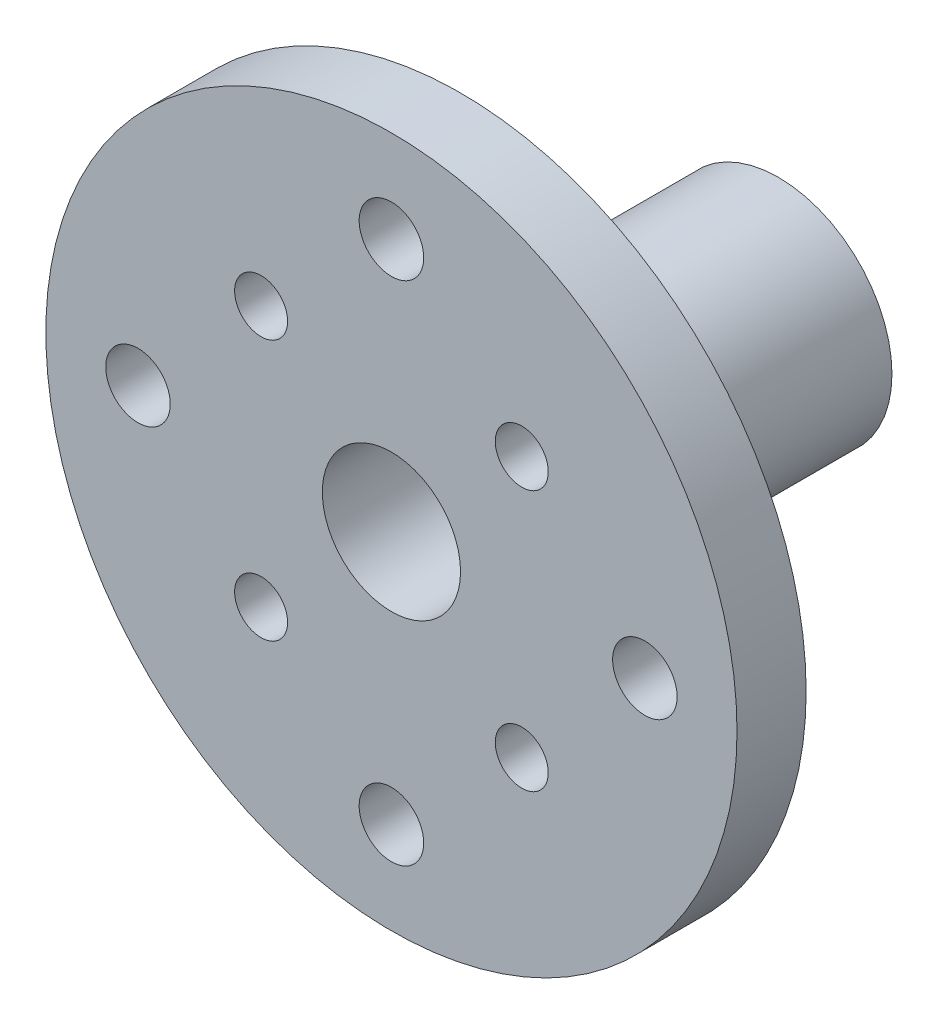
ISO-10303-21;
HEADER;
FILE_DESCRIPTION(('STEP AP214'),'2;1');
FILE_NAME('part.step','',(''),(''),'','','');
FILE_SCHEMA(('AUTOMOTIVE_DESIGN { 1 0 10303 214 1 1 1 1 }'));
ENDSEC;
DATA;
#1=APPLICATION_CONTEXT('core data for automotive mechanical design processes');
#2=APPLICATION_PROTOCOL_DEFINITION('international standard','automotive_design',2000,#1);
#3=PRODUCT_CONTEXT('',#1,'mechanical');
#4=PRODUCT('Part','Part','',(#3));
#5=PRODUCT_RELATED_PRODUCT_CATEGORY('part','',(#4));
#6=PRODUCT_DEFINITION_FORMATION('','',#4);
#7=PRODUCT_DEFINITION_CONTEXT('part definition',#1,'design');
#8=PRODUCT_DEFINITION('design','',#6,#7);
#9=PRODUCT_DEFINITION_SHAPE('','',#8);
#10=(LENGTH_UNIT() NAMED_UNIT(*) SI_UNIT(.MILLI.,.METRE.));
#11=(NAMED_UNIT(*) PLANE_ANGLE_UNIT() SI_UNIT($,.RADIAN.));
#12=(NAMED_UNIT(*) SI_UNIT($,.STERADIAN.) SOLID_ANGLE_UNIT());
#13=UNCERTAINTY_MEASURE_WITH_UNIT(LENGTH_MEASURE(1.E-05),#10,'distance_accuracy_value','');
#14=(GEOMETRIC_REPRESENTATION_CONTEXT(3) GLOBAL_UNCERTAINTY_ASSIGNED_CONTEXT((#13)) GLOBAL_UNIT_ASSIGNED_CONTEXT((#10,
#11,#12)) REPRESENTATION_CONTEXT('',''));
#15=CARTESIAN_POINT('',(0.,0.,0.));
#16=DIRECTION('',(0.,0.,1.));
#17=DIRECTION('',(1.,0.,0.));
#18=AXIS2_PLACEMENT_3D('',#15,#16,#17);
#19=CARTESIAN_POINT('',(0.,0.,13.8));
#20=DIRECTION('',(0.,0.,-1.));
#21=DIRECTION('',(-1.,0.,0.));
#22=AXIS2_PLACEMENT_3D('',#19,#20,#21);
#23=CYLINDRICAL_SURFACE('',#22,1.55);
#24=CARTESIAN_POINT('',(0.,0.,0.));
#25=DIRECTION('',(0.,0.,1.));
#26=DIRECTION('',(1.,0.,0.));
#27=AXIS2_PLACEMENT_3D('',#24,#25,#26);
#28=CIRCLE('',#27,1.55);
#29=CARTESIAN_POINT('',(-1.55,0.,0.));
#30=VERTEX_POINT('',#29);
#31=EDGE_CURVE('E52',#30,#30,#28,.T.);
#32=CARTESIAN_POINT('',(0.,0.,6.8));
#33=DIRECTION('',(0.,0.,1.));
#34=DIRECTION('',(1.,0.,0.));
#35=AXIS2_PLACEMENT_3D('',#32,#33,#34);
#36=CIRCLE('',#35,1.55);
#37=CARTESIAN_POINT('',(-1.55,0.,6.8));
#38=VERTEX_POINT('',#37);
#39=EDGE_CURVE('E41',#38,#38,#36,.T.);
#40=CARTESIAN_POINT('',(-1.55,0.,0.));
#41=CARTESIAN_POINT('',(-1.55,0.,0.0708333333333337));
#42=CARTESIAN_POINT('',(-1.55,0.,0.141666666666667));
#43=CARTESIAN_POINT('',(-1.55,0.,0.283333333333334));
#44=CARTESIAN_POINT('',(-1.55,0.,0.354166666666667));
#45=CARTESIAN_POINT('',(-1.55,0.,0.495833333333334));
#46=CARTESIAN_POINT('',(-1.55,0.,0.566666666666667));
#47=CARTESIAN_POINT('',(-1.55,0.,0.708333333333334));
#48=CARTESIAN_POINT('',(-1.55,0.,0.779166666666667));
#49=CARTESIAN_POINT('',(-1.55,0.,0.920833333333334));
#50=CARTESIAN_POINT('',(-1.55,0.,0.991666666666667));
#51=CARTESIAN_POINT('',(-1.55,0.,1.13333333333333));
#52=CARTESIAN_POINT('',(-1.55,0.,1.20416666666667));
#53=CARTESIAN_POINT('',(-1.55,0.,1.34583333333333));
#54=CARTESIAN_POINT('',(-1.55,0.,1.41666666666667));
#55=CARTESIAN_POINT('',(-1.55,0.,1.55833333333333));
#56=CARTESIAN_POINT('',(-1.55,0.,1.62916666666667));
#57=CARTESIAN_POINT('',(-1.55,0.,1.77083333333333));
#58=CARTESIAN_POINT('',(-1.55,0.,1.84166666666667));
#59=CARTESIAN_POINT('',(-1.55,0.,1.98333333333333));
#60=CARTESIAN_POINT('',(-1.55,0.,2.05416666666667));
#61=CARTESIAN_POINT('',(-1.55,0.,2.19583333333333));
#62=CARTESIAN_POINT('',(-1.55,0.,2.26666666666667));
#63=CARTESIAN_POINT('',(-1.55,0.,2.40833333333333));
#64=CARTESIAN_POINT('',(-1.55,0.,2.47916666666667));
#65=CARTESIAN_POINT('',(-1.55,0.,2.62083333333333));
#66=CARTESIAN_POINT('',(-1.55,0.,2.69166666666667));
#67=CARTESIAN_POINT('',(-1.55,0.,2.83333333333333));
#68=CARTESIAN_POINT('',(-1.55,0.,2.90416666666667));
#69=CARTESIAN_POINT('',(-1.55,0.,3.04583333333333));
#70=CARTESIAN_POINT('',(-1.55,0.,3.11666666666667));
#71=CARTESIAN_POINT('',(-1.55,0.,3.25833333333333));
#72=CARTESIAN_POINT('',(-1.55,0.,3.32916666666667));
#73=CARTESIAN_POINT('',(-1.55,0.,3.47083333333333));
#74=CARTESIAN_POINT('',(-1.55,0.,3.54166666666667));
#75=CARTESIAN_POINT('',(-1.55,0.,3.68333333333333));
#76=CARTESIAN_POINT('',(-1.55,0.,3.75416666666667));
#77=CARTESIAN_POINT('',(-1.55,0.,3.89583333333333));
#78=CARTESIAN_POINT('',(-1.55,0.,3.96666666666667));
#79=CARTESIAN_POINT('',(-1.55,0.,4.10833333333333));
#80=CARTESIAN_POINT('',(-1.55,0.,4.17916666666667));
#81=CARTESIAN_POINT('',(-1.55,0.,4.32083333333333));
#82=CARTESIAN_POINT('',(-1.55,0.,4.39166666666667));
#83=CARTESIAN_POINT('',(-1.55,0.,4.53333333333333));
#84=CARTESIAN_POINT('',(-1.55,0.,4.60416666666667));
#85=CARTESIAN_POINT('',(-1.55,0.,4.74583333333334));
#86=CARTESIAN_POINT('',(-1.55,0.,4.81666666666667));
#87=CARTESIAN_POINT('',(-1.55,0.,4.95833333333333));
#88=CARTESIAN_POINT('',(-1.55,0.,5.02916666666667));
#89=CARTESIAN_POINT('',(-1.55,0.,5.17083333333334));
#90=CARTESIAN_POINT('',(-1.55,0.,5.24166666666667));
#91=CARTESIAN_POINT('',(-1.55,0.,5.38333333333333));
#92=CARTESIAN_POINT('',(-1.55,0.,5.45416666666667));
#93=CARTESIAN_POINT('',(-1.55,0.,5.59583333333334));
#94=CARTESIAN_POINT('',(-1.55,0.,5.66666666666667));
#95=CARTESIAN_POINT('',(-1.55,0.,5.80833333333334));
#96=CARTESIAN_POINT('',(-1.55,0.,5.87916666666667));
#97=CARTESIAN_POINT('',(-1.55,0.,6.02083333333334));
#98=CARTESIAN_POINT('',(-1.55,0.,6.09166666666667));
#99=CARTESIAN_POINT('',(-1.55,0.,6.23333333333333));
#100=CARTESIAN_POINT('',(-1.55,0.,6.30416666666667));
#101=CARTESIAN_POINT('',(-1.55,0.,6.44583333333333));
#102=CARTESIAN_POINT('',(-1.55,0.,6.51666666666667));
#103=CARTESIAN_POINT('',(-1.55,0.,6.65833333333333));
#104=CARTESIAN_POINT('',(-1.55,0.,6.72916666666667));
#105=CARTESIAN_POINT('',(-1.55,0.,6.8));
#106=B_SPLINE_CURVE_WITH_KNOTS('',3,(#40,#41,#42,#43,#44,#45,#46,#47,#48,#49,#50,#51,#52,#53,
#54,#55,#56,#57,#58,#59,#60,#61,#62,#63,#64,#65,#66,#67,#68,#69,#70,#71,#72,#73,#74,#75,#76,#77,
#78,#79,#80,#81,#82,#83,#84,#85,#86,#87,#88,#89,#90,#91,#92,#93,#94,#95,#96,#97,#98,#99,#100,
#101,#102,#103,#104,#105),.UNSPECIFIED.,.F.,.F.,(4,2,2,2,2,2,2,2,2,2,2,2,2,2,2,2,2,2,2,2,2,2,2,
2,2,2,2,2,2,2,2,2,4),(0.,0.212500000000001,0.425,0.637500000000001,0.85,1.0625,1.275,1.4875,1.7,
1.9125,2.125,2.3375,2.55,2.7625,2.975,3.1875,3.4,3.6125,3.825,4.0375,4.25,4.4625,4.675,4.8875,
5.1,5.3125,5.525,5.7375,5.95,6.1625,6.375,6.5875,6.8),.UNSPECIFIED.);
#107=EDGE_CURVE('BSEAM37',#30,#38,#106,.T.);
#108=ORIENTED_EDGE('',*,*,#31,.F.);
#109=ORIENTED_EDGE('',*,*,#39,.T.);
#110=ORIENTED_EDGE('',*,*,#107,.T.);
#111=ORIENTED_EDGE('',*,*,#107,.F.);
#112=EDGE_LOOP('',(#108,#110,#109,#111));
#113=FACE_BOUND('',#112,.T.);
#114=ADVANCED_FACE('F37',(#113),#23,.F.);
#115=CARTESIAN_POINT('',(0.,0.,0.));
#116=DIRECTION('',(0.,0.,1.));
#117=DIRECTION('',(1.,0.,0.));
#118=AXIS2_PLACEMENT_3D('',#115,#116,#117);
#119=PLANE('',#118);
#120=CARTESIAN_POINT('',(0.,0.,0.));
#121=DIRECTION('',(0.,0.,1.));
#122=DIRECTION('',(1.,0.,0.));
#123=AXIS2_PLACEMENT_3D('',#120,#121,#122);
#124=CIRCLE('',#123,4.925);
#125=CARTESIAN_POINT('',(-4.925,0.,0.));
#126=VERTEX_POINT('',#125);
#127=EDGE_CURVE('E46',#126,#126,#124,.T.);
#128=ORIENTED_EDGE('',*,*,#127,.F.);
#129=EDGE_LOOP('',(#128));
#130=FACE_BOUND('',#129,.T.);
#131=ORIENTED_EDGE('',*,*,#31,.T.);
#132=EDGE_LOOP('',(#131));
#133=FACE_BOUND('',#132,.T.);
#134=ADVANCED_FACE('F154',(#130,#133),#119,.F.);
#135=CARTESIAN_POINT('',(0.,0.,13.8));
#136=DIRECTION('',(0.,0.,-1.));
#137=DIRECTION('',(-1.,0.,0.));
#138=AXIS2_PLACEMENT_3D('',#135,#136,#137);
#139=CYLINDRICAL_SURFACE('',#138,4.925);
#140=CARTESIAN_POINT('',(0.,0.,13.8));
#141=DIRECTION('',(0.,0.,1.));
#142=DIRECTION('',(1.,0.,0.));
#143=AXIS2_PLACEMENT_3D('',#140,#141,#142);
#144=CIRCLE('',#143,4.925);
#145=CARTESIAN_POINT('',(-4.925,0.,13.8));
#146=VERTEX_POINT('',#145);
#147=EDGE_CURVE('E10',#146,#146,#144,.T.);
#148=CARTESIAN_POINT('',(-4.925,0.,13.8));
#149=CARTESIAN_POINT('',(-4.925,0.,13.65625));
#150=CARTESIAN_POINT('',(-4.925,0.,13.5125));
#151=CARTESIAN_POINT('',(-4.925,0.,13.225));
#152=CARTESIAN_POINT('',(-4.925,0.,13.08125));
#153=CARTESIAN_POINT('',(-4.925,0.,12.79375));
#154=CARTESIAN_POINT('',(-4.925,0.,12.65));
#155=CARTESIAN_POINT('',(-4.925,0.,12.3625));
#156=CARTESIAN_POINT('',(-4.925,0.,12.21875));
#157=CARTESIAN_POINT('',(-4.925,0.,11.93125));
#158=CARTESIAN_POINT('',(-4.925,0.,11.7875));
#159=CARTESIAN_POINT('',(-4.925,0.,11.5));
#160=CARTESIAN_POINT('',(-4.925,0.,11.35625));
#161=CARTESIAN_POINT('',(-4.925,0.,11.06875));
#162=CARTESIAN_POINT('',(-4.925,0.,10.925));
#163=CARTESIAN_POINT('',(-4.925,0.,10.6375));
#164=CARTESIAN_POINT('',(-4.925,0.,10.49375));
#165=CARTESIAN_POINT('',(-4.925,0.,10.20625));
#166=CARTESIAN_POINT('',(-4.925,0.,10.0625));
#167=CARTESIAN_POINT('',(-4.925,0.,9.775));
#168=CARTESIAN_POINT('',(-4.925,0.,9.63125));
#169=CARTESIAN_POINT('',(-4.925,0.,9.34375));
#170=CARTESIAN_POINT('',(-4.925,0.,9.2));
#171=CARTESIAN_POINT('',(-4.925,0.,8.9125));
#172=CARTESIAN_POINT('',(-4.925,0.,8.76875));
#173=CARTESIAN_POINT('',(-4.925,0.,8.48125));
#174=CARTESIAN_POINT('',(-4.925,0.,8.3375));
#175=CARTESIAN_POINT('',(-4.925,0.,8.05));
#176=CARTESIAN_POINT('',(-4.925,0.,7.90625));
#177=CARTESIAN_POINT('',(-4.925,0.,7.61875));
#178=CARTESIAN_POINT('',(-4.925,0.,7.475));
#179=CARTESIAN_POINT('',(-4.925,0.,7.1875));
#180=CARTESIAN_POINT('',(-4.925,0.,7.04375));
#181=CARTESIAN_POINT('',(-4.925,0.,6.75625));
#182=CARTESIAN_POINT('',(-4.925,0.,6.6125));
#183=CARTESIAN_POINT('',(-4.925,0.,6.325));
#184=CARTESIAN_POINT('',(-4.925,0.,6.18125));
#185=CARTESIAN_POINT('',(-4.925,0.,5.89375));
#186=CARTESIAN_POINT('',(-4.925,0.,5.75));
#187=CARTESIAN_POINT('',(-4.925,0.,5.4625));
#188=CARTESIAN_POINT('',(-4.925,0.,5.31875));
#189=CARTESIAN_POINT('',(-4.925,0.,5.03125));
#190=CARTESIAN_POINT('',(-4.925,0.,4.8875));
#191=CARTESIAN_POINT('',(-4.925,0.,4.6));
#192=CARTESIAN_POINT('',(-4.925,0.,4.45625));
#193=CARTESIAN_POINT('',(-4.925,0.,4.16875));
#194=CARTESIAN_POINT('',(-4.925,0.,4.025));
#195=CARTESIAN_POINT('',(-4.925,0.,3.7375));
#196=CARTESIAN_POINT('',(-4.925,0.,3.59375));
#197=CARTESIAN_POINT('',(-4.925,0.,3.30625));
#198=CARTESIAN_POINT('',(-4.925,0.,3.1625));
#199=CARTESIAN_POINT('',(-4.925,0.,2.875));
#200=CARTESIAN_POINT('',(-4.925,0.,2.73125));
#201=CARTESIAN_POINT('',(-4.925,0.,2.44375));
#202=CARTESIAN_POINT('',(-4.925,0.,2.3));
#203=CARTESIAN_POINT('',(-4.925,0.,2.0125));
#204=CARTESIAN_POINT('',(-4.925,0.,1.86875));
#205=CARTESIAN_POINT('',(-4.925,0.,1.58125));
#206=CARTESIAN_POINT('',(-4.925,0.,1.4375));
#207=CARTESIAN_POINT('',(-4.925,0.,1.15));
#208=CARTESIAN_POINT('',(-4.925,0.,1.00625));
#209=CARTESIAN_POINT('',(-4.925,0.,0.71875));
#210=CARTESIAN_POINT('',(-4.925,0.,0.575));
#211=CARTESIAN_POINT('',(-4.925,0.,0.2875));
#212=CARTESIAN_POINT('',(-4.925,0.,0.14375));
#213=CARTESIAN_POINT('',(-4.925,0.,0.));
#214=B_SPLINE_CURVE_WITH_KNOTS('',3,(#148,#149,#150,#151,#152,#153,#154,#155,#156,#157,#158,
#159,#160,#161,#162,#163,#164,#165,#166,#167,#168,#169,#170,#171,#172,#173,#174,#175,#176,#177,
#178,#179,#180,#181,#182,#183,#184,#185,#186,#187,#188,#189,#190,#191,#192,#193,#194,#195,#196,
#197,#198,#199,#200,#201,#202,#203,#204,#205,#206,#207,#208,#209,#210,#211,#212,#213),
.UNSPECIFIED.,.F.,.F.,(4,2,2,2,2,2,2,2,2,2,2,2,2,2,2,2,2,2,2,2,2,2,2,2,2,2,2,2,2,2,2,2,4),(0.,
0.431249999999999,0.862499999999999,1.29375,1.725,2.15625,2.5875,3.01875,3.45,3.88125,4.3125,
4.74375,5.175,5.60625,6.0375,6.46875,6.9,7.33125,7.7625,8.19375,8.625,9.05625,9.4875,9.91875,
10.35,10.78125,11.2125,11.64375,12.075,12.50625,12.9375,13.36875,13.8),.UNSPECIFIED.);
#215=EDGE_CURVE('BSEAM39',#146,#126,#214,.T.);
#216=ORIENTED_EDGE('',*,*,#147,.F.);
#217=ORIENTED_EDGE('',*,*,#127,.T.);
#218=ORIENTED_EDGE('',*,*,#215,.T.);
#219=ORIENTED_EDGE('',*,*,#215,.F.);
#220=EDGE_LOOP('',(#216,#218,#217,#219));
#221=FACE_BOUND('',#220,.T.);
#222=ADVANCED_FACE('F39',(#221),#139,.T.);
#223=CARTESIAN_POINT('',(0.,0.,16.8));
#224=DIRECTION('',(0.,0.,1.));
#225=DIRECTION('',(1.,0.,0.));
#226=AXIS2_PLACEMENT_3D('',#223,#224,#225);
#227=PLANE('',#226);
#228=CARTESIAN_POINT('',(0.,0.,16.8));
#229=DIRECTION('',(0.,0.,1.));
#230=DIRECTION('',(1.,0.,0.));
#231=AXIS2_PLACEMENT_3D('',#228,#229,#230);
#232=CIRCLE('',#231,3.);
#233=CARTESIAN_POINT('',(3.,0.,16.8));
#234=VERTEX_POINT('',#233);
#235=EDGE_CURVE('E129',#234,#234,#232,.T.);
#236=ORIENTED_EDGE('',*,*,#235,.F.);
#237=EDGE_LOOP('',(#236));
#238=FACE_BOUND('',#237,.T.);
#239=CARTESIAN_POINT('',(-5.65685424949235,-5.65685424949242,16.8));
#240=DIRECTION('',(0.,0.,1.));
#241=DIRECTION('',(1.,0.,0.));
#242=AXIS2_PLACEMENT_3D('',#239,#240,#241);
#243=CIRCLE('',#242,1.15);
#244=CARTESIAN_POINT('',(-4.50685424949235,-5.65685424949242,16.8));
#245=VERTEX_POINT('',#244);
#246=EDGE_CURVE('E118',#245,#245,#243,.T.);
#247=ORIENTED_EDGE('',*,*,#246,.F.);
#248=EDGE_LOOP('',(#247));
#249=FACE_BOUND('',#248,.T.);
#250=CARTESIAN_POINT('',(5.65685424949235,5.65685424949241,16.8));
#251=DIRECTION('',(0.,0.,1.));
#252=DIRECTION('',(1.,0.,0.));
#253=AXIS2_PLACEMENT_3D('',#250,#251,#252);
#254=CIRCLE('',#253,1.14999999999998);
#255=CARTESIAN_POINT('',(6.80685424949233,5.65685424949241,16.8));
#256=VERTEX_POINT('',#255);
#257=EDGE_CURVE('E102',#256,#256,#254,.T.);
#258=ORIENTED_EDGE('',*,*,#257,.F.);
#259=EDGE_LOOP('',(#258));
#260=FACE_BOUND('',#259,.T.);
#261=CARTESIAN_POINT('',(11.,0.,16.8));
#262=DIRECTION('',(0.,0.,1.));
#263=DIRECTION('',(1.,0.,0.));
#264=AXIS2_PLACEMENT_3D('',#261,#262,#263);
#265=CIRCLE('',#264,1.4);
#266=CARTESIAN_POINT('',(12.4,0.,16.8));
#267=VERTEX_POINT('',#266);
#268=EDGE_CURVE('E86',#267,#267,#265,.T.);
#269=ORIENTED_EDGE('',*,*,#268,.F.);
#270=EDGE_LOOP('',(#269));
#271=FACE_BOUND('',#270,.T.);
#272=CARTESIAN_POINT('',(-5.65685424949241,5.65685424949235,16.8));
#273=DIRECTION('',(0.,0.,1.));
#274=DIRECTION('',(1.,0.,0.));
#275=AXIS2_PLACEMENT_3D('',#272,#273,#274);
#276=CIRCLE('',#275,1.14999999999999);
#277=CARTESIAN_POINT('',(-4.50685424949242,5.65685424949235,16.8));
#278=VERTEX_POINT('',#277);
#279=EDGE_CURVE('E70',#278,#278,#276,.T.);
#280=ORIENTED_EDGE('',*,*,#279,.F.);
#281=EDGE_LOOP('',(#280));
#282=FACE_BOUND('',#281,.T.);
#283=CARTESIAN_POINT('',(0.,0.,16.8));
#284=DIRECTION('',(0.,0.,1.));
#285=DIRECTION('',(1.,0.,0.));
#286=AXIS2_PLACEMENT_3D('',#283,#284,#285);
#287=CIRCLE('',#286,15.);
#288=CARTESIAN_POINT('',(15.,0.,16.8));
#289=VERTEX_POINT('',#288);
#290=EDGE_CURVE('E57',#289,#289,#287,.T.);
#291=ORIENTED_EDGE('',*,*,#290,.T.);
#292=EDGE_LOOP('',(#291));
#293=FACE_BOUND('',#292,.T.);
#294=CARTESIAN_POINT('',(-11.,0.,16.8));
#295=DIRECTION('',(0.,0.,1.));
#296=DIRECTION('',(1.,0.,0.));
#297=AXIS2_PLACEMENT_3D('',#294,#295,#296);
#298=CIRCLE('',#297,1.4);
#299=CARTESIAN_POINT('',(-9.6,0.,16.8));
#300=VERTEX_POINT('',#299);
#301=EDGE_CURVE('E62',#300,#300,#298,.T.);
#302=ORIENTED_EDGE('',*,*,#301,.F.);
#303=EDGE_LOOP('',(#302));
#304=FACE_BOUND('',#303,.T.);
#305=CARTESIAN_POINT('',(0.,11.,16.8));
#306=DIRECTION('',(0.,0.,1.));
#307=DIRECTION('',(1.,0.,0.));
#308=AXIS2_PLACEMENT_3D('',#305,#306,#307);
#309=CIRCLE('',#308,1.4);
#310=CARTESIAN_POINT('',(1.4,11.,16.8));
#311=VERTEX_POINT('',#310);
#312=EDGE_CURVE('E78',#311,#311,#309,.T.);
#313=ORIENTED_EDGE('',*,*,#312,.F.);
#314=EDGE_LOOP('',(#313));
#315=FACE_BOUND('',#314,.T.);
#316=CARTESIAN_POINT('',(0.,-11.,16.8));
#317=DIRECTION('',(0.,0.,1.));
#318=DIRECTION('',(1.,0.,0.));
#319=AXIS2_PLACEMENT_3D('',#316,#317,#318);
#320=CIRCLE('',#319,1.4);
#321=CARTESIAN_POINT('',(1.4,-11.,16.8));
#322=VERTEX_POINT('',#321);
#323=EDGE_CURVE('E94',#322,#322,#320,.T.);
#324=ORIENTED_EDGE('',*,*,#323,.F.);
#325=EDGE_LOOP('',(#324));
#326=FACE_BOUND('',#325,.T.);
#327=CARTESIAN_POINT('',(5.65685424949241,-5.65685424949235,16.8));
#328=DIRECTION('',(0.,0.,1.));
#329=DIRECTION('',(1.,0.,0.));
#330=AXIS2_PLACEMENT_3D('',#327,#328,#329);
#331=CIRCLE('',#330,1.14999999999999);
#332=CARTESIAN_POINT('',(6.8068542494924,-5.65685424949235,16.8));
#333=VERTEX_POINT('',#332);
#334=EDGE_CURVE('E110',#333,#333,#331,.T.);
#335=ORIENTED_EDGE('',*,*,#334,.F.);
#336=EDGE_LOOP('',(#335));
#337=FACE_BOUND('',#336,.T.);
#338=ADVANCED_FACE('F171',(#238,#249,#260,#271,#282,#293,#304,#315,#326,#337),#227,.T.);
#339=CARTESIAN_POINT('',(0.,0.,13.8));
#340=DIRECTION('',(0.,0.,1.));
#341=DIRECTION('',(1.,0.,0.));
#342=AXIS2_PLACEMENT_3D('',#339,#340,#341);
#343=PLANE('',#342);
#344=ORIENTED_EDGE('',*,*,#147,.T.);
#345=EDGE_LOOP('',(#344));
#346=FACE_BOUND('',#345,.T.);
#347=CARTESIAN_POINT('',(0.,0.,13.8));
#348=DIRECTION('',(0.,0.,1.));
#349=DIRECTION('',(1.,0.,0.));
#350=AXIS2_PLACEMENT_3D('',#347,#348,#349);
#351=CIRCLE('',#350,15.);
#352=CARTESIAN_POINT('',(15.,0.,13.8));
#353=VERTEX_POINT('',#352);
#354=EDGE_CURVE('E58',#353,#353,#351,.T.);
#355=ORIENTED_EDGE('',*,*,#354,.F.);
#356=EDGE_LOOP('',(#355));
#357=FACE_BOUND('',#356,.T.);
#358=CARTESIAN_POINT('',(-11.,0.,13.8));
#359=DIRECTION('',(0.,0.,1.));
#360=DIRECTION('',(1.,0.,0.));
#361=AXIS2_PLACEMENT_3D('',#358,#359,#360);
#362=CIRCLE('',#361,1.4);
#363=CARTESIAN_POINT('',(-9.6,0.,13.8));
#364=VERTEX_POINT('',#363);
#365=EDGE_CURVE('E66',#364,#364,#362,.T.);
#366=ORIENTED_EDGE('',*,*,#365,.T.);
#367=EDGE_LOOP('',(#366));
#368=FACE_BOUND('',#367,.T.);
#369=CARTESIAN_POINT('',(-5.65685424949241,5.65685424949235,13.8));
#370=DIRECTION('',(0.,0.,1.));
#371=DIRECTION('',(1.,0.,0.));
#372=AXIS2_PLACEMENT_3D('',#369,#370,#371);
#373=CIRCLE('',#372,1.14999999999999);
#374=CARTESIAN_POINT('',(-4.50685424949242,5.65685424949235,13.8));
#375=VERTEX_POINT('',#374);
#376=EDGE_CURVE('E74',#375,#375,#373,.T.);
#377=ORIENTED_EDGE('',*,*,#376,.T.);
#378=EDGE_LOOP('',(#377));
#379=FACE_BOUND('',#378,.T.);
#380=CARTESIAN_POINT('',(0.,11.,13.8));
#381=DIRECTION('',(0.,0.,1.));
#382=DIRECTION('',(1.,0.,0.));
#383=AXIS2_PLACEMENT_3D('',#380,#381,#382);
#384=CIRCLE('',#383,1.4);
#385=CARTESIAN_POINT('',(1.4,11.,13.8));
#386=VERTEX_POINT('',#385);
#387=EDGE_CURVE('E82',#386,#386,#384,.T.);
#388=ORIENTED_EDGE('',*,*,#387,.T.);
#389=EDGE_LOOP('',(#388));
#390=FACE_BOUND('',#389,.T.);
#391=CARTESIAN_POINT('',(11.,0.,13.8));
#392=DIRECTION('',(0.,0.,1.));
#393=DIRECTION('',(1.,0.,0.));
#394=AXIS2_PLACEMENT_3D('',#391,#392,#393);
#395=CIRCLE('',#394,1.4);
#396=CARTESIAN_POINT('',(12.4,0.,13.8));
#397=VERTEX_POINT('',#396);
#398=EDGE_CURVE('E90',#397,#397,#395,.T.);
#399=ORIENTED_EDGE('',*,*,#398,.T.);
#400=EDGE_LOOP('',(#399));
#401=FACE_BOUND('',#400,.T.);
#402=CARTESIAN_POINT('',(0.,-11.,13.8));
#403=DIRECTION('',(0.,0.,1.));
#404=DIRECTION('',(1.,0.,0.));
#405=AXIS2_PLACEMENT_3D('',#402,#403,#404);
#406=CIRCLE('',#405,1.4);
#407=CARTESIAN_POINT('',(1.4,-11.,13.8));
#408=VERTEX_POINT('',#407);
#409=EDGE_CURVE('E98',#408,#408,#406,.T.);
#410=ORIENTED_EDGE('',*,*,#409,.T.);
#411=EDGE_LOOP('',(#410));
#412=FACE_BOUND('',#411,.T.);
#413=CARTESIAN_POINT('',(5.65685424949235,5.65685424949241,13.8));
#414=DIRECTION('',(0.,0.,1.));
#415=DIRECTION('',(1.,0.,0.));
#416=AXIS2_PLACEMENT_3D('',#413,#414,#415);
#417=CIRCLE('',#416,1.14999999999998);
#418=CARTESIAN_POINT('',(6.80685424949233,5.65685424949241,13.8));
#419=VERTEX_POINT('',#418);
#420=EDGE_CURVE('E106',#419,#419,#417,.T.);
#421=ORIENTED_EDGE('',*,*,#420,.T.);
#422=EDGE_LOOP('',(#421));
#423=FACE_BOUND('',#422,.T.);
#424=CARTESIAN_POINT('',(5.65685424949241,-5.65685424949235,13.8));
#425=DIRECTION('',(0.,0.,1.));
#426=DIRECTION('',(1.,0.,0.));
#427=AXIS2_PLACEMENT_3D('',#424,#425,#426);
#428=CIRCLE('',#427,1.14999999999999);
#429=CARTESIAN_POINT('',(6.8068542494924,-5.65685424949235,13.8));
#430=VERTEX_POINT('',#429);
#431=EDGE_CURVE('E114',#430,#430,#428,.T.);
#432=ORIENTED_EDGE('',*,*,#431,.T.);
#433=EDGE_LOOP('',(#432));
#434=FACE_BOUND('',#433,.T.);
#435=CARTESIAN_POINT('',(-5.65685424949235,-5.65685424949242,13.8));
#436=DIRECTION('',(0.,0.,1.));
#437=DIRECTION('',(1.,0.,0.));
#438=AXIS2_PLACEMENT_3D('',#435,#436,#437);
#439=CIRCLE('',#438,1.15);
#440=CARTESIAN_POINT('',(-4.50685424949235,-5.65685424949242,13.8));
#441=VERTEX_POINT('',#440);
#442=EDGE_CURVE('E122',#441,#441,#439,.T.);
#443=ORIENTED_EDGE('',*,*,#442,.T.);
#444=EDGE_LOOP('',(#443));
#445=FACE_BOUND('',#444,.T.);
#446=ADVANCED_FACE('F167',(#346,#357,#368,#379,#390,#401,#412,#423,#434,#445),#343,.F.);
#447=CARTESIAN_POINT('',(0.,0.,16.8));
#448=DIRECTION('',(0.,0.,-1.));
#449=DIRECTION('',(-1.,0.,0.));
#450=AXIS2_PLACEMENT_3D('',#447,#448,#449);
#451=CYLINDRICAL_SURFACE('',#450,15.);
#452=ORIENTED_EDGE('',*,*,#290,.F.);
#453=EDGE_LOOP('',(#452));
#454=FACE_BOUND('',#453,.T.);
#455=ORIENTED_EDGE('',*,*,#354,.T.);
#456=EDGE_LOOP('',(#455));
#457=FACE_BOUND('',#456,.T.);
#458=ADVANCED_FACE('F163',(#454,#457),#451,.T.);
#459=CARTESIAN_POINT('',(-11.,0.,16.8));
#460=DIRECTION('',(0.,0.,-1.));
#461=DIRECTION('',(-1.,0.,0.));
#462=AXIS2_PLACEMENT_3D('',#459,#460,#461);
#463=CYLINDRICAL_SURFACE('',#462,1.4);
#464=ORIENTED_EDGE('',*,*,#301,.T.);
#465=EDGE_LOOP('',(#464));
#466=FACE_BOUND('',#465,.T.);
#467=ORIENTED_EDGE('',*,*,#365,.F.);
#468=EDGE_LOOP('',(#467));
#469=FACE_BOUND('',#468,.T.);
#470=ADVANCED_FACE('F166',(#466,#469),#463,.F.);
#471=CARTESIAN_POINT('',(-5.65685424949241,5.65685424949235,16.8));
#472=DIRECTION('',(0.,0.,-1.));
#473=DIRECTION('',(-1.,0.,0.));
#474=AXIS2_PLACEMENT_3D('',#471,#472,#473);
#475=CYLINDRICAL_SURFACE('',#474,1.14999999999999);
#476=ORIENTED_EDGE('',*,*,#279,.T.);
#477=EDGE_LOOP('',(#476));
#478=FACE_BOUND('',#477,.T.);
#479=ORIENTED_EDGE('',*,*,#376,.F.);
#480=EDGE_LOOP('',(#479));
#481=FACE_BOUND('',#480,.T.);
#482=ADVANCED_FACE('F177',(#478,#481),#475,.F.);
#483=CARTESIAN_POINT('',(0.,11.,16.8));
#484=DIRECTION('',(0.,0.,-1.));
#485=DIRECTION('',(-1.,0.,0.));
#486=AXIS2_PLACEMENT_3D('',#483,#484,#485);
#487=CYLINDRICAL_SURFACE('',#486,1.4);
#488=ORIENTED_EDGE('',*,*,#312,.T.);
#489=EDGE_LOOP('',(#488));
#490=FACE_BOUND('',#489,.T.);
#491=ORIENTED_EDGE('',*,*,#387,.F.);
#492=EDGE_LOOP('',(#491));
#493=FACE_BOUND('',#492,.T.);
#494=ADVANCED_FACE('F181',(#490,#493),#487,.F.);
#495=CARTESIAN_POINT('',(11.,0.,16.8));
#496=DIRECTION('',(0.,0.,-1.));
#497=DIRECTION('',(-1.,0.,0.));
#498=AXIS2_PLACEMENT_3D('',#495,#496,#497);
#499=CYLINDRICAL_SURFACE('',#498,1.4);
#500=ORIENTED_EDGE('',*,*,#268,.T.);
#501=EDGE_LOOP('',(#500));
#502=FACE_BOUND('',#501,.T.);
#503=ORIENTED_EDGE('',*,*,#398,.F.);
#504=EDGE_LOOP('',(#503));
#505=FACE_BOUND('',#504,.T.);
#506=ADVANCED_FACE('F185',(#502,#505),#499,.F.);
#507=CARTESIAN_POINT('',(0.,-11.,16.8));
#508=DIRECTION('',(0.,0.,-1.));
#509=DIRECTION('',(-1.,0.,0.));
#510=AXIS2_PLACEMENT_3D('',#507,#508,#509);
#511=CYLINDRICAL_SURFACE('',#510,1.4);
#512=ORIENTED_EDGE('',*,*,#323,.T.);
#513=EDGE_LOOP('',(#512));
#514=FACE_BOUND('',#513,.T.);
#515=ORIENTED_EDGE('',*,*,#409,.F.);
#516=EDGE_LOOP('',(#515));
#517=FACE_BOUND('',#516,.T.);
#518=ADVANCED_FACE('F189',(#514,#517),#511,.F.);
#519=CARTESIAN_POINT('',(5.65685424949235,5.65685424949241,16.8));
#520=DIRECTION('',(0.,0.,-1.));
#521=DIRECTION('',(-1.,0.,0.));
#522=AXIS2_PLACEMENT_3D('',#519,#520,#521);
#523=CYLINDRICAL_SURFACE('',#522,1.14999999999998);
#524=ORIENTED_EDGE('',*,*,#257,.T.);
#525=EDGE_LOOP('',(#524));
#526=FACE_BOUND('',#525,.T.);
#527=ORIENTED_EDGE('',*,*,#420,.F.);
#528=EDGE_LOOP('',(#527));
#529=FACE_BOUND('',#528,.T.);
#530=ADVANCED_FACE('F193',(#526,#529),#523,.F.);
#531=CARTESIAN_POINT('',(5.65685424949241,-5.65685424949235,16.8));
#532=DIRECTION('',(0.,0.,-1.));
#533=DIRECTION('',(-1.,0.,0.));
#534=AXIS2_PLACEMENT_3D('',#531,#532,#533);
#535=CYLINDRICAL_SURFACE('',#534,1.14999999999999);
#536=ORIENTED_EDGE('',*,*,#334,.T.);
#537=EDGE_LOOP('',(#536));
#538=FACE_BOUND('',#537,.T.);
#539=ORIENTED_EDGE('',*,*,#431,.F.);
#540=EDGE_LOOP('',(#539));
#541=FACE_BOUND('',#540,.T.);
#542=ADVANCED_FACE('F197',(#538,#541),#535,.F.);
#543=CARTESIAN_POINT('',(-5.65685424949235,-5.65685424949242,16.8));
#544=DIRECTION('',(0.,0.,-1.));
#545=DIRECTION('',(-1.,0.,0.));
#546=AXIS2_PLACEMENT_3D('',#543,#544,#545);
#547=CYLINDRICAL_SURFACE('',#546,1.15);
#548=ORIENTED_EDGE('',*,*,#246,.T.);
#549=EDGE_LOOP('',(#548));
#550=FACE_BOUND('',#549,.T.);
#551=ORIENTED_EDGE('',*,*,#442,.F.);
#552=EDGE_LOOP('',(#551));
#553=FACE_BOUND('',#552,.T.);
#554=ADVANCED_FACE('F150',(#550,#553),#547,.F.);
#555=CARTESIAN_POINT('',(0.,0.,6.8));
#556=DIRECTION('',(0.,0.,1.));
#557=DIRECTION('',(1.,0.,0.));
#558=AXIS2_PLACEMENT_3D('',#555,#556,#557);
#559=CYLINDRICAL_SURFACE('',#558,3.);
#560=CARTESIAN_POINT('',(0.,0.,6.8));
#561=DIRECTION('',(0.,0.,1.));
#562=DIRECTION('',(1.,0.,0.));
#563=AXIS2_PLACEMENT_3D('',#560,#561,#562);
#564=CIRCLE('',#563,3.);
#565=CARTESIAN_POINT('',(3.,0.,6.8));
#566=VERTEX_POINT('',#565);
#567=EDGE_CURVE('E133',#566,#566,#564,.T.);
#568=ORIENTED_EDGE('',*,*,#567,.F.);
#569=EDGE_LOOP('',(#568));
#570=FACE_BOUND('',#569,.T.);
#571=ORIENTED_EDGE('',*,*,#235,.T.);
#572=EDGE_LOOP('',(#571));
#573=FACE_BOUND('',#572,.T.);
#574=ADVANCED_FACE('F145',(#570,#573),#559,.F.);
#575=CARTESIAN_POINT('',(0.,0.,6.8));
#576=DIRECTION('',(0.,0.,1.));
#577=DIRECTION('',(1.,0.,0.));
#578=AXIS2_PLACEMENT_3D('',#575,#576,#577);
#579=PLANE('',#578);
#580=ORIENTED_EDGE('',*,*,#39,.F.);
#581=EDGE_LOOP('',(#580));
#582=FACE_BOUND('',#581,.T.);
#583=ORIENTED_EDGE('',*,*,#567,.T.);
#584=EDGE_LOOP('',(#583));
#585=FACE_BOUND('',#584,.T.);
#586=ADVANCED_FACE('F143',(#582,#585),#579,.T.);
#587=CLOSED_SHELL('',(#114,#134,#222,#338,#446,#458,#470,#482,#494,#506,#518,#530,#542,#554,
#574,#586));
#588=MANIFOLD_SOLID_BREP('B2',#587);
#589=ADVANCED_BREP_SHAPE_REPRESENTATION('',(#18,#588),#14);
#590=SHAPE_DEFINITION_REPRESENTATION(#9,#589);
ENDSEC;
END-ISO-10303-21;
